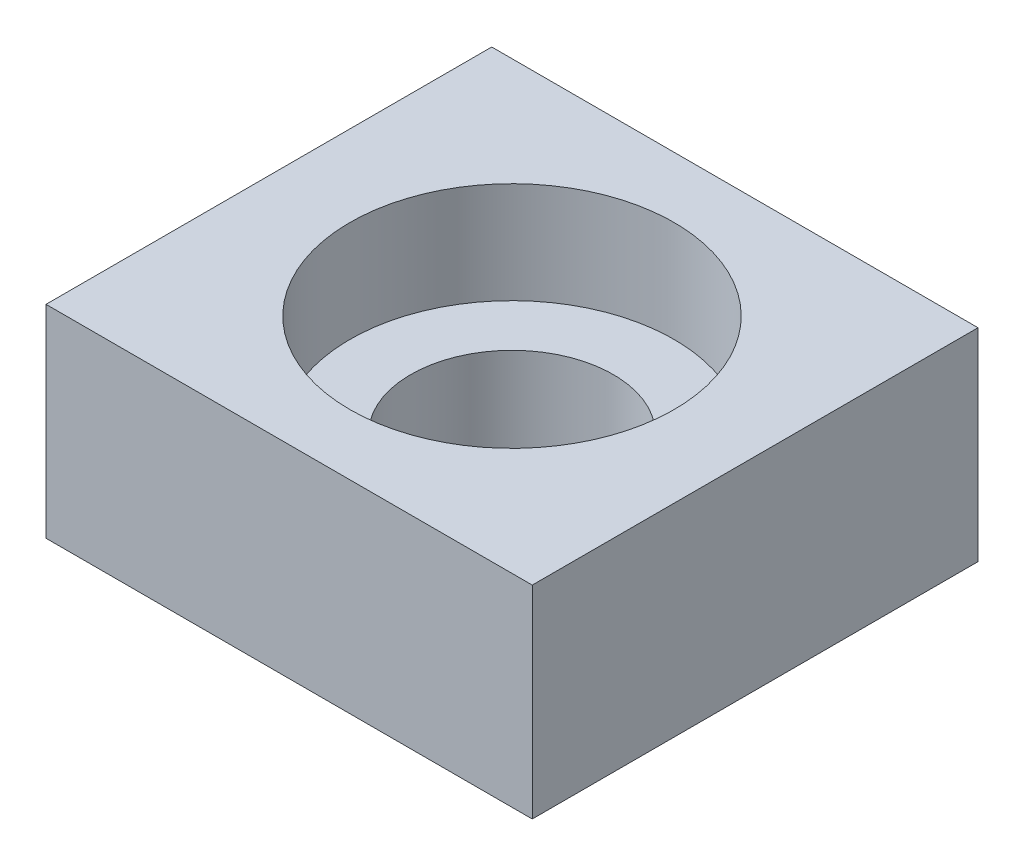
ISO-10303-21;
HEADER;
FILE_DESCRIPTION(('STEP AP214'),'2;1');
FILE_NAME('part.step','',(''),(''),'','','');
FILE_SCHEMA(('AUTOMOTIVE_DESIGN { 1 0 10303 214 1 1 1 1 }'));
ENDSEC;
DATA;
#1=APPLICATION_CONTEXT('core data for automotive mechanical design processes');
#2=APPLICATION_PROTOCOL_DEFINITION('international standard','automotive_design',2000,#1);
#3=PRODUCT_CONTEXT('',#1,'mechanical');
#4=PRODUCT('Part','Part','',(#3));
#5=PRODUCT_RELATED_PRODUCT_CATEGORY('part','',(#4));
#6=PRODUCT_DEFINITION_FORMATION('','',#4);
#7=PRODUCT_DEFINITION_CONTEXT('part definition',#1,'design');
#8=PRODUCT_DEFINITION('design','',#6,#7);
#9=PRODUCT_DEFINITION_SHAPE('','',#8);
#10=(LENGTH_UNIT() NAMED_UNIT(*) SI_UNIT(.MILLI.,.METRE.));
#11=(NAMED_UNIT(*) PLANE_ANGLE_UNIT() SI_UNIT($,.RADIAN.));
#12=(NAMED_UNIT(*) SI_UNIT($,.STERADIAN.) SOLID_ANGLE_UNIT());
#13=UNCERTAINTY_MEASURE_WITH_UNIT(LENGTH_MEASURE(1.E-05),#10,'distance_accuracy_value','');
#14=(GEOMETRIC_REPRESENTATION_CONTEXT(3) GLOBAL_UNCERTAINTY_ASSIGNED_CONTEXT((#13)) GLOBAL_UNIT_ASSIGNED_CONTEXT((#10,
#11,#12)) REPRESENTATION_CONTEXT('',''));
#15=CARTESIAN_POINT('',(0.,0.,0.));
#16=DIRECTION('',(0.,0.,1.));
#17=DIRECTION('',(1.,0.,0.));
#18=AXIS2_PLACEMENT_3D('',#15,#16,#17);
#19=CARTESIAN_POINT('',(6.,7.5,102.75));
#20=DIRECTION('',(1.,0.,0.));
#21=DIRECTION('',(0.,0.,-1.));
#22=AXIS2_PLACEMENT_3D('',#19,#20,#21);
#23=PLANE('',#22);
#24=DIRECTION('',(0.,1.,0.));
#25=VECTOR('',#24,1.);
#26=CARTESIAN_POINT('',(6.,7.5,91.75));
#27=LINE('',#26,#25);
#28=CARTESIAN_POINT('',(6.,7.5,91.75));
#29=VERTEX_POINT('',#28);
#30=CARTESIAN_POINT('',(6.,12.5,91.75));
#31=VERTEX_POINT('',#30);
#32=EDGE_CURVE('E36',#29,#31,#27,.T.);
#33=ORIENTED_EDGE('',*,*,#32,.T.);
#34=DIRECTION('',(0.,0.,-1.));
#35=VECTOR('',#34,1.);
#36=CARTESIAN_POINT('',(6.,12.5,102.75));
#37=LINE('',#36,#35);
#38=CARTESIAN_POINT('',(6.,12.5,102.75));
#39=VERTEX_POINT('',#38);
#40=EDGE_CURVE('E73',#39,#31,#37,.T.);
#41=ORIENTED_EDGE('',*,*,#40,.F.);
#42=DIRECTION('',(0.,1.,0.));
#43=VECTOR('',#42,1.);
#44=CARTESIAN_POINT('',(6.,7.5,102.75));
#45=LINE('',#44,#43);
#46=CARTESIAN_POINT('',(6.,7.5,102.75));
#47=VERTEX_POINT('',#46);
#48=EDGE_CURVE('E11',#47,#39,#45,.T.);
#49=ORIENTED_EDGE('',*,*,#48,.F.);
#50=DIRECTION('',(0.,0.,-1.));
#51=VECTOR('',#50,1.);
#52=CARTESIAN_POINT('',(6.,7.5,102.75));
#53=LINE('',#52,#51);
#54=EDGE_CURVE('E74',#47,#29,#53,.T.);
#55=ORIENTED_EDGE('',*,*,#54,.T.);
#56=EDGE_LOOP('',(#33,#41,#49,#55));
#57=FACE_BOUND('',#56,.T.);
#58=ADVANCED_FACE('F33',(#57),#23,.T.);
#59=CARTESIAN_POINT('',(-6.,7.5,102.75));
#60=DIRECTION('',(0.,0.,1.));
#61=DIRECTION('',(1.,0.,0.));
#62=AXIS2_PLACEMENT_3D('',#59,#60,#61);
#63=PLANE('',#62);
#64=ORIENTED_EDGE('',*,*,#48,.T.);
#65=DIRECTION('',(1.,0.,0.));
#66=VECTOR('',#65,1.);
#67=CARTESIAN_POINT('',(-6.,12.5,102.75));
#68=LINE('',#67,#66);
#69=CARTESIAN_POINT('',(-6.,12.5,102.75));
#70=VERTEX_POINT('',#69);
#71=EDGE_CURVE('E90',#70,#39,#68,.T.);
#72=ORIENTED_EDGE('',*,*,#71,.F.);
#73=DIRECTION('',(0.,1.,0.));
#74=VECTOR('',#73,1.);
#75=CARTESIAN_POINT('',(-6.,7.5,102.75));
#76=LINE('',#75,#74);
#77=CARTESIAN_POINT('',(-6.,7.5,102.75));
#78=VERTEX_POINT('',#77);
#79=EDGE_CURVE('E41',#78,#70,#76,.T.);
#80=ORIENTED_EDGE('',*,*,#79,.F.);
#81=DIRECTION('',(1.,0.,0.));
#82=VECTOR('',#81,1.);
#83=CARTESIAN_POINT('',(-6.,7.5,102.75));
#84=LINE('',#83,#82);
#85=EDGE_CURVE('E79',#78,#47,#84,.T.);
#86=ORIENTED_EDGE('',*,*,#85,.T.);
#87=EDGE_LOOP('',(#64,#72,#80,#86));
#88=FACE_BOUND('',#87,.T.);
#89=ADVANCED_FACE('F110',(#88),#63,.T.);
#90=CARTESIAN_POINT('',(-6.,7.5,102.75));
#91=DIRECTION('',(-1.,0.,0.));
#92=DIRECTION('',(0.,0.,1.));
#93=AXIS2_PLACEMENT_3D('',#90,#91,#92);
#94=PLANE('',#93);
#95=ORIENTED_EDGE('',*,*,#79,.T.);
#96=DIRECTION('',(0.,0.,1.));
#97=VECTOR('',#96,1.);
#98=CARTESIAN_POINT('',(-6.,12.5,102.75));
#99=LINE('',#98,#97);
#100=CARTESIAN_POINT('',(-6.,12.5,91.75));
#101=VERTEX_POINT('',#100);
#102=EDGE_CURVE('E86',#101,#70,#99,.T.);
#103=ORIENTED_EDGE('',*,*,#102,.F.);
#104=DIRECTION('',(0.,1.,0.));
#105=VECTOR('',#104,1.);
#106=CARTESIAN_POINT('',(-6.,7.5,91.75));
#107=LINE('',#106,#105);
#108=CARTESIAN_POINT('',(-6.,7.5,91.75));
#109=VERTEX_POINT('',#108);
#110=EDGE_CURVE('E78',#109,#101,#107,.T.);
#111=ORIENTED_EDGE('',*,*,#110,.F.);
#112=DIRECTION('',(0.,0.,1.));
#113=VECTOR('',#112,1.);
#114=CARTESIAN_POINT('',(-6.,7.5,102.75));
#115=LINE('',#114,#113);
#116=EDGE_CURVE('E103',#109,#78,#115,.T.);
#117=ORIENTED_EDGE('',*,*,#116,.T.);
#118=EDGE_LOOP('',(#95,#103,#111,#117));
#119=FACE_BOUND('',#118,.T.);
#120=ADVANCED_FACE('F107',(#119),#94,.T.);
#121=CARTESIAN_POINT('',(-6.,7.5,91.75));
#122=DIRECTION('',(0.,0.,-1.));
#123=DIRECTION('',(-1.,0.,0.));
#124=AXIS2_PLACEMENT_3D('',#121,#122,#123);
#125=PLANE('',#124);
#126=ORIENTED_EDGE('',*,*,#110,.T.);
#127=DIRECTION('',(-1.,0.,0.));
#128=VECTOR('',#127,1.);
#129=CARTESIAN_POINT('',(-6.,12.5,91.75));
#130=LINE('',#129,#128);
#131=EDGE_CURVE('E81',#31,#101,#130,.T.);
#132=ORIENTED_EDGE('',*,*,#131,.F.);
#133=ORIENTED_EDGE('',*,*,#32,.F.);
#134=DIRECTION('',(-1.,0.,0.));
#135=VECTOR('',#134,1.);
#136=CARTESIAN_POINT('',(-6.,7.5,91.75));
#137=LINE('',#136,#135);
#138=EDGE_CURVE('E101',#29,#109,#137,.T.);
#139=ORIENTED_EDGE('',*,*,#138,.T.);
#140=EDGE_LOOP('',(#126,#132,#133,#139));
#141=FACE_BOUND('',#140,.T.);
#142=ADVANCED_FACE('F82',(#141),#125,.T.);
#143=CARTESIAN_POINT('',(0.,7.5,0.));
#144=DIRECTION('',(0.,-1.,0.));
#145=DIRECTION('',(0.,0.,-1.));
#146=AXIS2_PLACEMENT_3D('',#143,#144,#145);
#147=PLANE('',#146);
#148=CARTESIAN_POINT('',(0.,7.5,97.2499999999999));
#149=DIRECTION('',(0.,1.,0.));
#150=DIRECTION('',(0.,0.,1.));
#151=AXIS2_PLACEMENT_3D('',#148,#149,#150);
#152=CIRCLE('',#151,2.5);
#153=CARTESIAN_POINT('',(0.,7.5,99.7499999999999));
#154=VERTEX_POINT('',#153);
#155=EDGE_CURVE('E186',#154,#154,#152,.T.);
#156=ORIENTED_EDGE('',*,*,#155,.T.);
#157=EDGE_LOOP('',(#156));
#158=FACE_BOUND('',#157,.T.);
#159=ORIENTED_EDGE('',*,*,#54,.F.);
#160=ORIENTED_EDGE('',*,*,#85,.F.);
#161=ORIENTED_EDGE('',*,*,#116,.F.);
#162=ORIENTED_EDGE('',*,*,#138,.F.);
#163=EDGE_LOOP('',(#159,#160,#161,#162));
#164=FACE_BOUND('',#163,.T.);
#165=ADVANCED_FACE('F112',(#158,#164),#147,.T.);
#166=CARTESIAN_POINT('',(0.,12.5,0.));
#167=DIRECTION('',(0.,-1.,0.));
#168=DIRECTION('',(0.,0.,-1.));
#169=AXIS2_PLACEMENT_3D('',#166,#167,#168);
#170=PLANE('',#169);
#171=CARTESIAN_POINT('',(0.,12.5,97.2499999999999));
#172=DIRECTION('',(0.,1.,0.));
#173=DIRECTION('',(0.,0.,1.));
#174=AXIS2_PLACEMENT_3D('',#171,#172,#173);
#175=CIRCLE('',#174,4.);
#176=CARTESIAN_POINT('',(0.,12.5,101.25));
#177=VERTEX_POINT('',#176);
#178=EDGE_CURVE('E94',#177,#177,#175,.T.);
#179=ORIENTED_EDGE('',*,*,#178,.F.);
#180=EDGE_LOOP('',(#179));
#181=FACE_BOUND('',#180,.T.);
#182=ORIENTED_EDGE('',*,*,#40,.T.);
#183=ORIENTED_EDGE('',*,*,#131,.T.);
#184=ORIENTED_EDGE('',*,*,#102,.T.);
#185=ORIENTED_EDGE('',*,*,#71,.T.);
#186=EDGE_LOOP('',(#182,#183,#184,#185));
#187=FACE_BOUND('',#186,.T.);
#188=ADVANCED_FACE('F89',(#181,#187),#170,.F.);
#189=CARTESIAN_POINT('',(0.,10.,97.2499999999999));
#190=DIRECTION('',(0.,1.,0.));
#191=DIRECTION('',(0.,0.,1.));
#192=AXIS2_PLACEMENT_3D('',#189,#190,#191);
#193=CYLINDRICAL_SURFACE('',#192,4.);
#194=CARTESIAN_POINT('',(0.,10.,97.2499999999999));
#195=DIRECTION('',(0.,1.,0.));
#196=DIRECTION('',(0.,0.,1.));
#197=AXIS2_PLACEMENT_3D('',#194,#195,#196);
#198=CIRCLE('',#197,4.);
#199=CARTESIAN_POINT('',(0.,10.,101.25));
#200=VERTEX_POINT('',#199);
#201=EDGE_CURVE('E91',#200,#200,#198,.T.);
#202=ORIENTED_EDGE('',*,*,#201,.F.);
#203=EDGE_LOOP('',(#202));
#204=FACE_BOUND('',#203,.T.);
#205=ORIENTED_EDGE('',*,*,#178,.T.);
#206=EDGE_LOOP('',(#205));
#207=FACE_BOUND('',#206,.T.);
#208=ADVANCED_FACE('F120',(#204,#207),#193,.F.);
#209=CARTESIAN_POINT('',(0.,10.,97.2499999999999));
#210=DIRECTION('',(0.,1.,0.));
#211=DIRECTION('',(0.,0.,1.));
#212=AXIS2_PLACEMENT_3D('',#209,#210,#211);
#213=PLANE('',#212);
#214=CARTESIAN_POINT('',(0.,10.,97.2499999999999));
#215=DIRECTION('',(0.,1.,0.));
#216=DIRECTION('',(0.,0.,1.));
#217=AXIS2_PLACEMENT_3D('',#214,#215,#216);
#218=CIRCLE('',#217,2.5);
#219=CARTESIAN_POINT('',(0.,10.,99.7499999999999));
#220=VERTEX_POINT('',#219);
#221=EDGE_CURVE('E189',#220,#220,#218,.T.);
#222=ORIENTED_EDGE('',*,*,#221,.F.);
#223=EDGE_LOOP('',(#222));
#224=FACE_BOUND('',#223,.T.);
#225=ORIENTED_EDGE('',*,*,#201,.T.);
#226=EDGE_LOOP('',(#225));
#227=FACE_BOUND('',#226,.T.);
#228=ADVANCED_FACE('F161',(#224,#227),#213,.T.);
#229=CARTESIAN_POINT('',(0.,7.5,97.2499999999999));
#230=DIRECTION('',(0.,1.,0.));
#231=DIRECTION('',(0.,0.,1.));
#232=AXIS2_PLACEMENT_3D('',#229,#230,#231);
#233=CYLINDRICAL_SURFACE('',#232,2.5);
#234=ORIENTED_EDGE('',*,*,#155,.F.);
#235=EDGE_LOOP('',(#234));
#236=FACE_BOUND('',#235,.T.);
#237=ORIENTED_EDGE('',*,*,#221,.T.);
#238=EDGE_LOOP('',(#237));
#239=FACE_BOUND('',#238,.T.);
#240=ADVANCED_FACE('F171',(#236,#239),#233,.F.);
#241=CLOSED_SHELL('',(#58,#89,#120,#142,#165,#188,#208,#228,#240));
#242=MANIFOLD_SOLID_BREP('B2',#241);
#243=ADVANCED_BREP_SHAPE_REPRESENTATION('',(#18,#242),#14);
#244=SHAPE_DEFINITION_REPRESENTATION(#9,#243);
ENDSEC;
END-ISO-10303-21;
